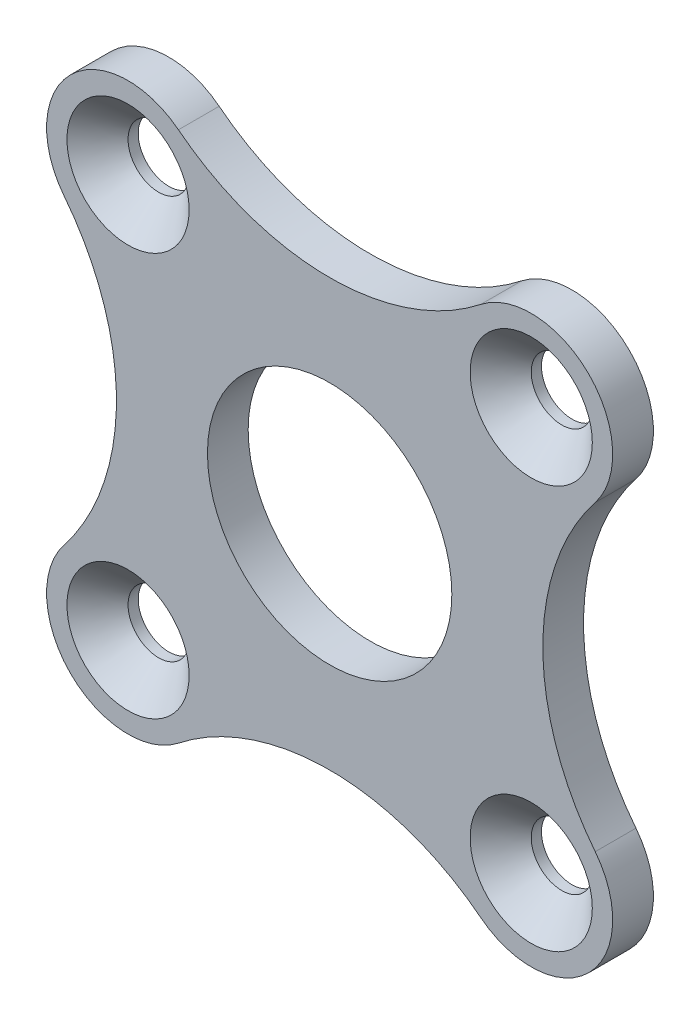
ISO-10303-21;
HEADER;
FILE_DESCRIPTION(('STEP AP214'),'2;1');
FILE_NAME('part.step','',(''),(''),'','','');
FILE_SCHEMA(('AUTOMOTIVE_DESIGN { 1 0 10303 214 1 1 1 1 }'));
ENDSEC;
DATA;
#1=APPLICATION_CONTEXT('core data for automotive mechanical design processes');
#2=APPLICATION_PROTOCOL_DEFINITION('international standard','automotive_design',2000,#1);
#3=PRODUCT_CONTEXT('',#1,'mechanical');
#4=PRODUCT('Part','Part','',(#3));
#5=PRODUCT_RELATED_PRODUCT_CATEGORY('part','',(#4));
#6=PRODUCT_DEFINITION_FORMATION('','',#4);
#7=PRODUCT_DEFINITION_CONTEXT('part definition',#1,'design');
#8=PRODUCT_DEFINITION('design','',#6,#7);
#9=PRODUCT_DEFINITION_SHAPE('','',#8);
#10=(LENGTH_UNIT() NAMED_UNIT(*) SI_UNIT(.MILLI.,.METRE.));
#11=(NAMED_UNIT(*) PLANE_ANGLE_UNIT() SI_UNIT($,.RADIAN.));
#12=(NAMED_UNIT(*) SI_UNIT($,.STERADIAN.) SOLID_ANGLE_UNIT());
#13=UNCERTAINTY_MEASURE_WITH_UNIT(LENGTH_MEASURE(1.E-05),#10,'distance_accuracy_value','');
#14=(GEOMETRIC_REPRESENTATION_CONTEXT(3) GLOBAL_UNCERTAINTY_ASSIGNED_CONTEXT((#13)) GLOBAL_UNIT_ASSIGNED_CONTEXT((#10,
#11,#12)) REPRESENTATION_CONTEXT('',''));
#15=CARTESIAN_POINT('',(0.,0.,0.));
#16=DIRECTION('',(0.,0.,1.));
#17=DIRECTION('',(1.,0.,0.));
#18=AXIS2_PLACEMENT_3D('',#15,#16,#17);
#19=CARTESIAN_POINT('',(9.89949493661167,9.89949493661167,2.00000000012324));
#20=DIRECTION('',(0.,0.,1.));
#21=DIRECTION('',(1.,0.,0.));
#22=AXIS2_PLACEMENT_3D('',#19,#20,#21);
#23=CONICAL_SURFACE('',#22,3.00000000006397,0.785398163378501);
#24=CARTESIAN_POINT('',(9.89949493661167,9.89949493661167,0.5));
#25=DIRECTION('',(0.,0.,1.));
#26=DIRECTION('',(1.,0.,0.));
#27=AXIS2_PLACEMENT_3D('',#24,#25,#26);
#28=CIRCLE('',#27,1.5);
#29=CARTESIAN_POINT('',(11.3994949366117,9.89949493661167,0.5));
#30=VERTEX_POINT('',#29);
#31=EDGE_CURVE('E100',#30,#30,#28,.F.);
#32=ORIENTED_EDGE('',*,*,#31,.T.);
#33=EDGE_LOOP('',(#32));
#34=FACE_BOUND('',#33,.T.);
#35=CARTESIAN_POINT('',(9.89949493661167,9.89949493661167,2.00000000000955));
#36=DIRECTION('',(0.,0.,1.));
#37=DIRECTION('',(1.,0.,0.));
#38=AXIS2_PLACEMENT_3D('',#35,#36,#37);
#39=CIRCLE('',#38,2.99999999995028);
#40=CARTESIAN_POINT('',(12.899494936562,9.89949493661167,2.00000000000955));
#41=VERTEX_POINT('',#40);
#42=EDGE_CURVE('E20',#41,#41,#39,.F.);
#43=ORIENTED_EDGE('',*,*,#42,.F.);
#44=EDGE_LOOP('',(#43));
#45=FACE_BOUND('',#44,.T.);
#46=ADVANCED_FACE('F17',(#34,#45),#23,.F.);
#47=CARTESIAN_POINT('',(9.89949493661166,-9.89949493661167,2.00000000006639));
#48=DIRECTION('',(0.,0.,1.));
#49=DIRECTION('',(1.,0.,0.));
#50=AXIS2_PLACEMENT_3D('',#47,#48,#49);
#51=CONICAL_SURFACE('',#50,3.00000000006398,0.785398163397448);
#52=CARTESIAN_POINT('',(9.89949493661166,-9.89949493661167,0.5));
#53=DIRECTION('',(0.,0.,1.));
#54=DIRECTION('',(1.,0.,0.));
#55=AXIS2_PLACEMENT_3D('',#52,#53,#54);
#56=CIRCLE('',#55,1.5);
#57=CARTESIAN_POINT('',(11.3994949366117,-9.89949493661167,0.5));
#58=VERTEX_POINT('',#57);
#59=EDGE_CURVE('E219',#58,#58,#56,.F.);
#60=ORIENTED_EDGE('',*,*,#59,.T.);
#61=EDGE_LOOP('',(#60));
#62=FACE_BOUND('',#61,.T.);
#63=CARTESIAN_POINT('',(9.89949493661166,-9.89949493661167,2.00000000004516));
#64=DIRECTION('',(0.,0.,1.));
#65=DIRECTION('',(1.,0.,0.));
#66=AXIS2_PLACEMENT_3D('',#63,#64,#65);
#67=CIRCLE('',#66,3.00000000004275);
#68=CARTESIAN_POINT('',(12.8994949366544,-9.89949493661167,2.00000000004516));
#69=VERTEX_POINT('',#68);
#70=EDGE_CURVE('E126',#69,#69,#67,.F.);
#71=ORIENTED_EDGE('',*,*,#70,.F.);
#72=EDGE_LOOP('',(#71));
#73=FACE_BOUND('',#72,.T.);
#74=ADVANCED_FACE('F137',(#62,#73),#51,.F.);
#75=CARTESIAN_POINT('',(-9.89949493661167,9.89949493661167,2.00000000006639));
#76=DIRECTION('',(0.,0.,1.));
#77=DIRECTION('',(1.,0.,0.));
#78=AXIS2_PLACEMENT_3D('',#75,#76,#77);
#79=CONICAL_SURFACE('',#78,3.00000000002153,0.785398163397448);
#80=CARTESIAN_POINT('',(-9.89949493661167,9.89949493661167,0.5));
#81=DIRECTION('',(0.,0.,1.));
#82=DIRECTION('',(1.,0.,0.));
#83=AXIS2_PLACEMENT_3D('',#80,#81,#82);
#84=CIRCLE('',#83,1.5);
#85=CARTESIAN_POINT('',(-8.39949493661167,9.89949493661167,0.5));
#86=VERTEX_POINT('',#85);
#87=EDGE_CURVE('E217',#86,#86,#84,.F.);
#88=ORIENTED_EDGE('',*,*,#87,.T.);
#89=EDGE_LOOP('',(#88));
#90=FACE_BOUND('',#89,.T.);
#91=CARTESIAN_POINT('',(-9.89949493661167,9.89949493661167,2.00000000003077));
#92=DIRECTION('',(0.,0.,1.));
#93=DIRECTION('',(1.,0.,0.));
#94=AXIS2_PLACEMENT_3D('',#91,#92,#93);
#95=CIRCLE('',#94,2.9999999999859);
#96=CARTESIAN_POINT('',(-6.89949493662577,9.89949493661167,2.00000000003077));
#97=VERTEX_POINT('',#96);
#98=EDGE_CURVE('E128',#97,#97,#95,.F.);
#99=ORIENTED_EDGE('',*,*,#98,.F.);
#100=EDGE_LOOP('',(#99));
#101=FACE_BOUND('',#100,.T.);
#102=ADVANCED_FACE('F143',(#90,#101),#79,.F.);
#103=CARTESIAN_POINT('',(0.,0.,2.));
#104=DIRECTION('',(0.,0.,1.));
#105=DIRECTION('',(1.,0.,0.));
#106=AXIS2_PLACEMENT_3D('',#103,#104,#105);
#107=PLANE('',#106);
#108=ORIENTED_EDGE('',*,*,#70,.T.);
#109=EDGE_LOOP('',(#108));
#110=FACE_BOUND('',#109,.T.);
#111=ORIENTED_EDGE('',*,*,#98,.T.);
#112=EDGE_LOOP('',(#111));
#113=FACE_BOUND('',#112,.T.);
#114=CARTESIAN_POINT('',(0.,0.,2.));
#115=DIRECTION('',(0.,0.,1.));
#116=DIRECTION('',(1.,0.,0.));
#117=AXIS2_PLACEMENT_3D('',#114,#115,#116);
#118=CIRCLE('',#117,6.);
#119=CARTESIAN_POINT('',(6.,0.,2.));
#120=VERTEX_POINT('',#119);
#121=EDGE_CURVE('E104',#120,#120,#118,.F.);
#122=ORIENTED_EDGE('',*,*,#121,.T.);
#123=EDGE_LOOP('',(#122));
#124=FACE_BOUND('',#123,.T.);
#125=CARTESIAN_POINT('',(-9.89949493661167,-9.89949493661166,2.00000000003077));
#126=DIRECTION('',(0.,0.,1.));
#127=DIRECTION('',(1.,0.,0.));
#128=AXIS2_PLACEMENT_3D('',#125,#126,#127);
#129=CIRCLE('',#128,2.9999999999859);
#130=CARTESIAN_POINT('',(-6.89949493662577,-9.89949493661166,2.00000000003077));
#131=VERTEX_POINT('',#130);
#132=EDGE_CURVE('E89',#131,#131,#129,.F.);
#133=ORIENTED_EDGE('',*,*,#132,.T.);
#134=EDGE_LOOP('',(#133));
#135=FACE_BOUND('',#134,.T.);
#136=ORIENTED_EDGE('',*,*,#42,.T.);
#137=EDGE_LOOP('',(#136));
#138=FACE_BOUND('',#137,.T.);
#139=CARTESIAN_POINT('',(-9.89949493661167,-9.89949493661165,2.));
#140=DIRECTION('',(0.,0.,1.));
#141=DIRECTION('',(1.,0.,0.));
#142=AXIS2_PLACEMENT_3D('',#139,#140,#141);
#143=CIRCLE('',#142,4.);
#144=CARTESIAN_POINT('',(-7.42462120245876,-13.0419462091058,2.));
#145=VERTEX_POINT('',#144);
#146=CARTESIAN_POINT('',(-13.0419462091058,-7.42462120245874,2.));
#147=VERTEX_POINT('',#146);
#148=EDGE_CURVE('E108',#145,#147,#143,.F.);
#149=ORIENTED_EDGE('',*,*,#148,.F.);
#150=CARTESIAN_POINT('',(0.,-22.4693000265882,2.));
#151=DIRECTION('',(0.,0.,1.));
#152=DIRECTION('',(1.,0.,0.));
#153=AXIS2_PLACEMENT_3D('',#150,#151,#152);
#154=CIRCLE('',#153,12.);
#155=CARTESIAN_POINT('',(7.42462120245873,-13.0419462091058,2.));
#156=VERTEX_POINT('',#155);
#157=EDGE_CURVE('E95',#145,#156,#154,.F.);
#158=ORIENTED_EDGE('',*,*,#157,.T.);
#159=CARTESIAN_POINT('',(9.89949493661165,-9.89949493661167,2.));
#160=DIRECTION('',(0.,0.,1.));
#161=DIRECTION('',(1.,0.,0.));
#162=AXIS2_PLACEMENT_3D('',#159,#160,#161);
#163=CIRCLE('',#162,4.);
#164=CARTESIAN_POINT('',(13.0419462091058,-7.42462120245876,2.));
#165=VERTEX_POINT('',#164);
#166=EDGE_CURVE('E92',#165,#156,#163,.F.);
#167=ORIENTED_EDGE('',*,*,#166,.F.);
#168=CARTESIAN_POINT('',(22.4693000265882,0.,2.));
#169=DIRECTION('',(0.,0.,1.));
#170=DIRECTION('',(1.,0.,0.));
#171=AXIS2_PLACEMENT_3D('',#168,#169,#170);
#172=CIRCLE('',#171,12.);
#173=CARTESIAN_POINT('',(13.0419462091058,7.42462120245872,2.));
#174=VERTEX_POINT('',#173);
#175=EDGE_CURVE('E80',#165,#174,#172,.F.);
#176=ORIENTED_EDGE('',*,*,#175,.T.);
#177=CARTESIAN_POINT('',(9.89949493661167,9.89949493661165,2.));
#178=DIRECTION('',(0.,0.,1.));
#179=DIRECTION('',(1.,0.,0.));
#180=AXIS2_PLACEMENT_3D('',#177,#178,#179);
#181=CIRCLE('',#180,4.00000000000001);
#182=CARTESIAN_POINT('',(7.42462120245875,13.0419462091058,2.));
#183=VERTEX_POINT('',#182);
#184=EDGE_CURVE('E88',#183,#174,#181,.F.);
#185=ORIENTED_EDGE('',*,*,#184,.F.);
#186=CARTESIAN_POINT('',(0.,22.4693000265882,2.));
#187=DIRECTION('',(0.,0.,1.));
#188=DIRECTION('',(1.,0.,0.));
#189=AXIS2_PLACEMENT_3D('',#186,#187,#188);
#190=CIRCLE('',#189,12.);
#191=CARTESIAN_POINT('',(-7.42462120245874,13.0419462091058,2.));
#192=VERTEX_POINT('',#191);
#193=EDGE_CURVE('E118',#183,#192,#190,.F.);
#194=ORIENTED_EDGE('',*,*,#193,.T.);
#195=CARTESIAN_POINT('',(-9.89949493661166,9.89949493661167,2.));
#196=DIRECTION('',(0.,0.,1.));
#197=DIRECTION('',(1.,0.,0.));
#198=AXIS2_PLACEMENT_3D('',#195,#196,#197);
#199=CIRCLE('',#198,4.);
#200=CARTESIAN_POINT('',(-13.0419462091058,7.42462120245876,2.));
#201=VERTEX_POINT('',#200);
#202=EDGE_CURVE('E115',#201,#192,#199,.F.);
#203=ORIENTED_EDGE('',*,*,#202,.F.);
#204=CARTESIAN_POINT('',(-22.4693000265882,0.,2.));
#205=DIRECTION('',(0.,0.,1.));
#206=DIRECTION('',(1.,0.,0.));
#207=AXIS2_PLACEMENT_3D('',#204,#205,#206);
#208=CIRCLE('',#207,12.);
#209=EDGE_CURVE('E111',#201,#147,#208,.F.);
#210=ORIENTED_EDGE('',*,*,#209,.T.);
#211=EDGE_LOOP('',(#149,#158,#167,#176,#185,#194,#203,#210));
#212=FACE_BOUND('',#211,.T.);
#213=ADVANCED_FACE('F97',(#110,#113,#124,#135,#138,#212),#107,.T.);
#214=CARTESIAN_POINT('',(-9.89949493661167,-9.89949493661166,2.00000000006639));
#215=DIRECTION('',(0.,0.,1.));
#216=DIRECTION('',(1.,0.,0.));
#217=AXIS2_PLACEMENT_3D('',#214,#215,#216);
#218=CONICAL_SURFACE('',#217,3.00000000002153,0.785398163397448);
#219=CARTESIAN_POINT('',(-9.89949493661167,-9.89949493661166,0.5));
#220=DIRECTION('',(0.,0.,1.));
#221=DIRECTION('',(1.,0.,0.));
#222=AXIS2_PLACEMENT_3D('',#219,#220,#221);
#223=CIRCLE('',#222,1.5);
#224=CARTESIAN_POINT('',(-8.39949493661167,-9.89949493661166,0.5));
#225=VERTEX_POINT('',#224);
#226=EDGE_CURVE('E222',#225,#225,#223,.F.);
#227=ORIENTED_EDGE('',*,*,#226,.T.);
#228=EDGE_LOOP('',(#227));
#229=FACE_BOUND('',#228,.T.);
#230=ORIENTED_EDGE('',*,*,#132,.F.);
#231=EDGE_LOOP('',(#230));
#232=FACE_BOUND('',#231,.T.);
#233=ADVANCED_FACE('F203',(#229,#232),#218,.F.);
#234=CARTESIAN_POINT('',(22.4693000265882,0.,0.));
#235=DIRECTION('',(0.,0.,1.));
#236=DIRECTION('',(1.,0.,0.));
#237=AXIS2_PLACEMENT_3D('',#234,#235,#236);
#238=CYLINDRICAL_SURFACE('',#237,12.);
#239=DIRECTION('',(0.,0.,1.));
#240=VECTOR('',#239,1.);
#241=CARTESIAN_POINT('',(13.0419462091058,7.42462120245872,0.));
#242=LINE('',#241,#240);
#243=CARTESIAN_POINT('',(13.0419462091058,7.42462120245872,0.));
#244=VERTEX_POINT('',#243);
#245=EDGE_CURVE('E85',#174,#244,#242,.F.);
#246=ORIENTED_EDGE('',*,*,#245,.F.);
#247=ORIENTED_EDGE('',*,*,#175,.F.);
#248=DIRECTION('',(0.,0.,1.));
#249=VECTOR('',#248,1.);
#250=CARTESIAN_POINT('',(13.0419462091058,-7.42462120245876,0.));
#251=LINE('',#250,#249);
#252=CARTESIAN_POINT('',(13.0419462091058,-7.42462120245876,0.));
#253=VERTEX_POINT('',#252);
#254=EDGE_CURVE('E84',#253,#165,#251,.T.);
#255=ORIENTED_EDGE('',*,*,#254,.F.);
#256=CARTESIAN_POINT('',(22.4693000265882,0.,0.));
#257=DIRECTION('',(0.,0.,1.));
#258=DIRECTION('',(1.,0.,0.));
#259=AXIS2_PLACEMENT_3D('',#256,#257,#258);
#260=CIRCLE('',#259,12.);
#261=EDGE_CURVE('E266',#253,#244,#260,.F.);
#262=ORIENTED_EDGE('',*,*,#261,.T.);
#263=EDGE_LOOP('',(#246,#247,#255,#262));
#264=FACE_BOUND('',#263,.T.);
#265=ADVANCED_FACE('F82',(#264),#238,.F.);
#266=CARTESIAN_POINT('',(9.89949493661167,9.89949493661165,0.));
#267=DIRECTION('',(0.,0.,1.));
#268=DIRECTION('',(1.,0.,0.));
#269=AXIS2_PLACEMENT_3D('',#266,#267,#268);
#270=CYLINDRICAL_SURFACE('',#269,4.00000000000001);
#271=ORIENTED_EDGE('',*,*,#184,.T.);
#272=ORIENTED_EDGE('',*,*,#245,.T.);
#273=CARTESIAN_POINT('',(9.89949493661167,9.89949493661165,0.));
#274=DIRECTION('',(0.,0.,1.));
#275=DIRECTION('',(1.,0.,0.));
#276=AXIS2_PLACEMENT_3D('',#273,#274,#275);
#277=CIRCLE('',#276,4.00000000000001);
#278=CARTESIAN_POINT('',(7.42462120245875,13.0419462091058,0.));
#279=VERTEX_POINT('',#278);
#280=EDGE_CURVE('E264',#244,#279,#277,.T.);
#281=ORIENTED_EDGE('',*,*,#280,.T.);
#282=DIRECTION('',(0.,0.,1.));
#283=VECTOR('',#282,1.);
#284=CARTESIAN_POINT('',(7.42462120245875,13.0419462091058,0.));
#285=LINE('',#284,#283);
#286=EDGE_CURVE('E121',#279,#183,#285,.T.);
#287=ORIENTED_EDGE('',*,*,#286,.T.);
#288=EDGE_LOOP('',(#271,#272,#281,#287));
#289=FACE_BOUND('',#288,.T.);
#290=ADVANCED_FACE('F196',(#289),#270,.T.);
#291=CARTESIAN_POINT('',(0.,22.4693000265882,0.));
#292=DIRECTION('',(0.,0.,1.));
#293=DIRECTION('',(1.,0.,0.));
#294=AXIS2_PLACEMENT_3D('',#291,#292,#293);
#295=CYLINDRICAL_SURFACE('',#294,12.);
#296=DIRECTION('',(0.,0.,1.));
#297=VECTOR('',#296,1.);
#298=CARTESIAN_POINT('',(-7.42462120245873,13.0419462091058,0.));
#299=LINE('',#298,#297);
#300=CARTESIAN_POINT('',(-7.42462120245874,13.0419462091058,0.));
#301=VERTEX_POINT('',#300);
#302=EDGE_CURVE('E117',#192,#301,#299,.F.);
#303=ORIENTED_EDGE('',*,*,#302,.F.);
#304=ORIENTED_EDGE('',*,*,#193,.F.);
#305=ORIENTED_EDGE('',*,*,#286,.F.);
#306=CARTESIAN_POINT('',(0.,22.4693000265882,0.));
#307=DIRECTION('',(0.,0.,1.));
#308=DIRECTION('',(1.,0.,0.));
#309=AXIS2_PLACEMENT_3D('',#306,#307,#308);
#310=CIRCLE('',#309,12.);
#311=EDGE_CURVE('E261',#279,#301,#310,.F.);
#312=ORIENTED_EDGE('',*,*,#311,.T.);
#313=EDGE_LOOP('',(#303,#304,#305,#312));
#314=FACE_BOUND('',#313,.T.);
#315=ADVANCED_FACE('F192',(#314),#295,.F.);
#316=CARTESIAN_POINT('',(-9.89949493661166,9.89949493661167,0.));
#317=DIRECTION('',(0.,0.,1.));
#318=DIRECTION('',(1.,0.,0.));
#319=AXIS2_PLACEMENT_3D('',#316,#317,#318);
#320=CYLINDRICAL_SURFACE('',#319,4.);
#321=ORIENTED_EDGE('',*,*,#202,.T.);
#322=ORIENTED_EDGE('',*,*,#302,.T.);
#323=CARTESIAN_POINT('',(-9.89949493661166,9.89949493661167,0.));
#324=DIRECTION('',(0.,0.,1.));
#325=DIRECTION('',(1.,0.,0.));
#326=AXIS2_PLACEMENT_3D('',#323,#324,#325);
#327=CIRCLE('',#326,4.);
#328=CARTESIAN_POINT('',(-13.0419462091058,7.42462120245876,0.));
#329=VERTEX_POINT('',#328);
#330=EDGE_CURVE('E258',#301,#329,#327,.T.);
#331=ORIENTED_EDGE('',*,*,#330,.T.);
#332=DIRECTION('',(0.,0.,1.));
#333=VECTOR('',#332,1.);
#334=CARTESIAN_POINT('',(-13.0419462091058,7.42462120245876,0.));
#335=LINE('',#334,#333);
#336=EDGE_CURVE('E114',#329,#201,#335,.T.);
#337=ORIENTED_EDGE('',*,*,#336,.T.);
#338=EDGE_LOOP('',(#321,#322,#331,#337));
#339=FACE_BOUND('',#338,.T.);
#340=ADVANCED_FACE('F188',(#339),#320,.T.);
#341=CARTESIAN_POINT('',(-22.4693000265882,0.,0.));
#342=DIRECTION('',(0.,0.,1.));
#343=DIRECTION('',(1.,0.,0.));
#344=AXIS2_PLACEMENT_3D('',#341,#342,#343);
#345=CYLINDRICAL_SURFACE('',#344,12.);
#346=DIRECTION('',(0.,0.,1.));
#347=VECTOR('',#346,1.);
#348=CARTESIAN_POINT('',(-13.0419462091058,-7.42462120245874,0.));
#349=LINE('',#348,#347);
#350=CARTESIAN_POINT('',(-13.0419462091058,-7.42462120245874,0.));
#351=VERTEX_POINT('',#350);
#352=EDGE_CURVE('E110',#147,#351,#349,.F.);
#353=ORIENTED_EDGE('',*,*,#352,.F.);
#354=ORIENTED_EDGE('',*,*,#209,.F.);
#355=ORIENTED_EDGE('',*,*,#336,.F.);
#356=CARTESIAN_POINT('',(-22.4693000265882,0.,0.));
#357=DIRECTION('',(0.,0.,1.));
#358=DIRECTION('',(1.,0.,0.));
#359=AXIS2_PLACEMENT_3D('',#356,#357,#358);
#360=CIRCLE('',#359,12.);
#361=EDGE_CURVE('E255',#329,#351,#360,.F.);
#362=ORIENTED_EDGE('',*,*,#361,.T.);
#363=EDGE_LOOP('',(#353,#354,#355,#362));
#364=FACE_BOUND('',#363,.T.);
#365=ADVANCED_FACE('F184',(#364),#345,.F.);
#366=CARTESIAN_POINT('',(-9.89949493661167,-9.89949493661165,0.));
#367=DIRECTION('',(0.,0.,1.));
#368=DIRECTION('',(1.,0.,0.));
#369=AXIS2_PLACEMENT_3D('',#366,#367,#368);
#370=CYLINDRICAL_SURFACE('',#369,4.);
#371=ORIENTED_EDGE('',*,*,#148,.T.);
#372=ORIENTED_EDGE('',*,*,#352,.T.);
#373=CARTESIAN_POINT('',(-9.89949493661167,-9.89949493661165,0.));
#374=DIRECTION('',(0.,0.,1.));
#375=DIRECTION('',(1.,0.,0.));
#376=AXIS2_PLACEMENT_3D('',#373,#374,#375);
#377=CIRCLE('',#376,4.);
#378=CARTESIAN_POINT('',(-7.42462120245876,-13.0419462091058,0.));
#379=VERTEX_POINT('',#378);
#380=EDGE_CURVE('E252',#351,#379,#377,.T.);
#381=ORIENTED_EDGE('',*,*,#380,.T.);
#382=DIRECTION('',(0.,0.,1.));
#383=VECTOR('',#382,1.);
#384=CARTESIAN_POINT('',(-7.42462120245875,-13.0419462091058,0.));
#385=LINE('',#384,#383);
#386=EDGE_CURVE('E107',#379,#145,#385,.T.);
#387=ORIENTED_EDGE('',*,*,#386,.T.);
#388=EDGE_LOOP('',(#371,#372,#381,#387));
#389=FACE_BOUND('',#388,.T.);
#390=ADVANCED_FACE('F180',(#389),#370,.T.);
#391=CARTESIAN_POINT('',(0.,-22.4693000265882,0.));
#392=DIRECTION('',(0.,0.,1.));
#393=DIRECTION('',(1.,0.,0.));
#394=AXIS2_PLACEMENT_3D('',#391,#392,#393);
#395=CYLINDRICAL_SURFACE('',#394,12.);
#396=DIRECTION('',(0.,0.,1.));
#397=VECTOR('',#396,1.);
#398=CARTESIAN_POINT('',(7.42462120245873,-13.0419462091058,0.));
#399=LINE('',#398,#397);
#400=CARTESIAN_POINT('',(7.42462120245873,-13.0419462091058,0.));
#401=VERTEX_POINT('',#400);
#402=EDGE_CURVE('E35',#156,#401,#399,.F.);
#403=ORIENTED_EDGE('',*,*,#402,.F.);
#404=ORIENTED_EDGE('',*,*,#157,.F.);
#405=ORIENTED_EDGE('',*,*,#386,.F.);
#406=CARTESIAN_POINT('',(0.,-22.4693000265882,0.));
#407=DIRECTION('',(0.,0.,1.));
#408=DIRECTION('',(1.,0.,0.));
#409=AXIS2_PLACEMENT_3D('',#406,#407,#408);
#410=CIRCLE('',#409,12.);
#411=EDGE_CURVE('E249',#379,#401,#410,.F.);
#412=ORIENTED_EDGE('',*,*,#411,.T.);
#413=EDGE_LOOP('',(#403,#404,#405,#412));
#414=FACE_BOUND('',#413,.T.);
#415=ADVANCED_FACE('F177',(#414),#395,.F.);
#416=CARTESIAN_POINT('',(9.89949493661165,-9.89949493661167,0.));
#417=DIRECTION('',(0.,0.,1.));
#418=DIRECTION('',(1.,0.,0.));
#419=AXIS2_PLACEMENT_3D('',#416,#417,#418);
#420=CYLINDRICAL_SURFACE('',#419,4.);
#421=ORIENTED_EDGE('',*,*,#166,.T.);
#422=ORIENTED_EDGE('',*,*,#402,.T.);
#423=CARTESIAN_POINT('',(9.89949493661165,-9.89949493661167,0.));
#424=DIRECTION('',(0.,0.,1.));
#425=DIRECTION('',(1.,0.,0.));
#426=AXIS2_PLACEMENT_3D('',#423,#424,#425);
#427=CIRCLE('',#426,4.);
#428=EDGE_CURVE('E94',#401,#253,#427,.T.);
#429=ORIENTED_EDGE('',*,*,#428,.T.);
#430=ORIENTED_EDGE('',*,*,#254,.T.);
#431=EDGE_LOOP('',(#421,#422,#429,#430));
#432=FACE_BOUND('',#431,.T.);
#433=ADVANCED_FACE('F91',(#432),#420,.T.);
#434=CARTESIAN_POINT('',(9.89949493661167,9.89949493661167,0.));
#435=DIRECTION('',(0.,0.,1.));
#436=DIRECTION('',(1.,0.,0.));
#437=AXIS2_PLACEMENT_3D('',#434,#435,#436);
#438=CYLINDRICAL_SURFACE('',#437,1.5);
#439=CARTESIAN_POINT('',(9.89949493661167,9.89949493661167,0.));
#440=DIRECTION('',(0.,0.,1.));
#441=DIRECTION('',(1.,0.,0.));
#442=AXIS2_PLACEMENT_3D('',#439,#440,#441);
#443=CIRCLE('',#442,1.5);
#444=CARTESIAN_POINT('',(11.3994949366117,9.89949493661167,0.));
#445=VERTEX_POINT('',#444);
#446=EDGE_CURVE('E245',#445,#445,#443,.F.);
#447=ORIENTED_EDGE('',*,*,#446,.T.);
#448=EDGE_LOOP('',(#447));
#449=FACE_BOUND('',#448,.T.);
#450=ORIENTED_EDGE('',*,*,#31,.F.);
#451=EDGE_LOOP('',(#450));
#452=FACE_BOUND('',#451,.T.);
#453=ADVANCED_FACE('F170',(#449,#452),#438,.F.);
#454=CARTESIAN_POINT('',(9.89949493661166,-9.89949493661167,0.));
#455=DIRECTION('',(0.,0.,1.));
#456=DIRECTION('',(1.,0.,0.));
#457=AXIS2_PLACEMENT_3D('',#454,#455,#456);
#458=CYLINDRICAL_SURFACE('',#457,1.5);
#459=CARTESIAN_POINT('',(9.89949493661166,-9.89949493661167,0.));
#460=DIRECTION('',(0.,0.,1.));
#461=DIRECTION('',(1.,0.,0.));
#462=AXIS2_PLACEMENT_3D('',#459,#460,#461);
#463=CIRCLE('',#462,1.5);
#464=CARTESIAN_POINT('',(11.3994949366117,-9.89949493661167,0.));
#465=VERTEX_POINT('',#464);
#466=EDGE_CURVE('E242',#465,#465,#463,.F.);
#467=ORIENTED_EDGE('',*,*,#466,.T.);
#468=EDGE_LOOP('',(#467));
#469=FACE_BOUND('',#468,.T.);
#470=ORIENTED_EDGE('',*,*,#59,.F.);
#471=EDGE_LOOP('',(#470));
#472=FACE_BOUND('',#471,.T.);
#473=ADVANCED_FACE('F166',(#469,#472),#458,.F.);
#474=CARTESIAN_POINT('',(-9.89949493661167,9.89949493661167,0.));
#475=DIRECTION('',(0.,0.,1.));
#476=DIRECTION('',(1.,0.,0.));
#477=AXIS2_PLACEMENT_3D('',#474,#475,#476);
#478=CYLINDRICAL_SURFACE('',#477,1.5);
#479=CARTESIAN_POINT('',(-9.89949493661167,9.89949493661167,0.));
#480=DIRECTION('',(0.,0.,1.));
#481=DIRECTION('',(1.,0.,0.));
#482=AXIS2_PLACEMENT_3D('',#479,#480,#481);
#483=CIRCLE('',#482,1.5);
#484=CARTESIAN_POINT('',(-8.39949493661167,9.89949493661167,0.));
#485=VERTEX_POINT('',#484);
#486=EDGE_CURVE('E239',#485,#485,#483,.F.);
#487=ORIENTED_EDGE('',*,*,#486,.T.);
#488=EDGE_LOOP('',(#487));
#489=FACE_BOUND('',#488,.T.);
#490=ORIENTED_EDGE('',*,*,#87,.F.);
#491=EDGE_LOOP('',(#490));
#492=FACE_BOUND('',#491,.T.);
#493=ADVANCED_FACE('F162',(#489,#492),#478,.F.);
#494=CARTESIAN_POINT('',(0.,0.,0.));
#495=DIRECTION('',(0.,0.,1.));
#496=DIRECTION('',(1.,0.,0.));
#497=AXIS2_PLACEMENT_3D('',#494,#495,#496);
#498=CYLINDRICAL_SURFACE('',#497,6.);
#499=CARTESIAN_POINT('',(0.,0.,0.));
#500=DIRECTION('',(0.,0.,1.));
#501=DIRECTION('',(1.,0.,0.));
#502=AXIS2_PLACEMENT_3D('',#499,#500,#501);
#503=CIRCLE('',#502,6.);
#504=CARTESIAN_POINT('',(6.,0.,0.));
#505=VERTEX_POINT('',#504);
#506=EDGE_CURVE('E26',#505,#505,#503,.F.);
#507=ORIENTED_EDGE('',*,*,#506,.T.);
#508=EDGE_LOOP('',(#507));
#509=FACE_BOUND('',#508,.T.);
#510=ORIENTED_EDGE('',*,*,#121,.F.);
#511=EDGE_LOOP('',(#510));
#512=FACE_BOUND('',#511,.T.);
#513=ADVANCED_FACE('F154',(#509,#512),#498,.F.);
#514=CARTESIAN_POINT('',(-9.89949493661167,-9.89949493661166,0.));
#515=DIRECTION('',(0.,0.,1.));
#516=DIRECTION('',(1.,0.,0.));
#517=AXIS2_PLACEMENT_3D('',#514,#515,#516);
#518=CYLINDRICAL_SURFACE('',#517,1.5);
#519=CARTESIAN_POINT('',(-9.89949493661167,-9.89949493661166,0.));
#520=DIRECTION('',(0.,0.,1.));
#521=DIRECTION('',(1.,0.,0.));
#522=AXIS2_PLACEMENT_3D('',#519,#520,#521);
#523=CIRCLE('',#522,1.5);
#524=CARTESIAN_POINT('',(-8.39949493661167,-9.89949493661166,0.));
#525=VERTEX_POINT('',#524);
#526=EDGE_CURVE('E11',#525,#525,#523,.F.);
#527=ORIENTED_EDGE('',*,*,#526,.T.);
#528=EDGE_LOOP('',(#527));
#529=FACE_BOUND('',#528,.T.);
#530=ORIENTED_EDGE('',*,*,#226,.F.);
#531=EDGE_LOOP('',(#530));
#532=FACE_BOUND('',#531,.T.);
#533=ADVANCED_FACE('F148',(#529,#532),#518,.F.);
#534=CARTESIAN_POINT('',(0.,0.,0.));
#535=DIRECTION('',(0.,0.,1.));
#536=DIRECTION('',(1.,0.,0.));
#537=AXIS2_PLACEMENT_3D('',#534,#535,#536);
#538=PLANE('',#537);
#539=ORIENTED_EDGE('',*,*,#526,.F.);
#540=EDGE_LOOP('',(#539));
#541=FACE_BOUND('',#540,.T.);
#542=ORIENTED_EDGE('',*,*,#506,.F.);
#543=EDGE_LOOP('',(#542));
#544=FACE_BOUND('',#543,.T.);
#545=ORIENTED_EDGE('',*,*,#486,.F.);
#546=EDGE_LOOP('',(#545));
#547=FACE_BOUND('',#546,.T.);
#548=ORIENTED_EDGE('',*,*,#466,.F.);
#549=EDGE_LOOP('',(#548));
#550=FACE_BOUND('',#549,.T.);
#551=ORIENTED_EDGE('',*,*,#446,.F.);
#552=EDGE_LOOP('',(#551));
#553=FACE_BOUND('',#552,.T.);
#554=ORIENTED_EDGE('',*,*,#411,.F.);
#555=ORIENTED_EDGE('',*,*,#380,.F.);
#556=ORIENTED_EDGE('',*,*,#361,.F.);
#557=ORIENTED_EDGE('',*,*,#330,.F.);
#558=ORIENTED_EDGE('',*,*,#311,.F.);
#559=ORIENTED_EDGE('',*,*,#280,.F.);
#560=ORIENTED_EDGE('',*,*,#261,.F.);
#561=ORIENTED_EDGE('',*,*,#428,.F.);
#562=EDGE_LOOP('',(#554,#555,#556,#557,#558,#559,#560,#561));
#563=FACE_BOUND('',#562,.T.);
#564=ADVANCED_FACE('F146',(#541,#544,#547,#550,#553,#563),#538,.F.);
#565=CLOSED_SHELL('',(#46,#74,#102,#213,#233,#265,#290,#315,#340,#365,#390,#415,#433,#453,#473,
#493,#513,#533,#564));
#566=MANIFOLD_SOLID_BREP('B1',#565);
#567=ADVANCED_BREP_SHAPE_REPRESENTATION('',(#18,#566),#14);
#568=SHAPE_DEFINITION_REPRESENTATION(#9,#567);
ENDSEC;
END-ISO-10303-21;
